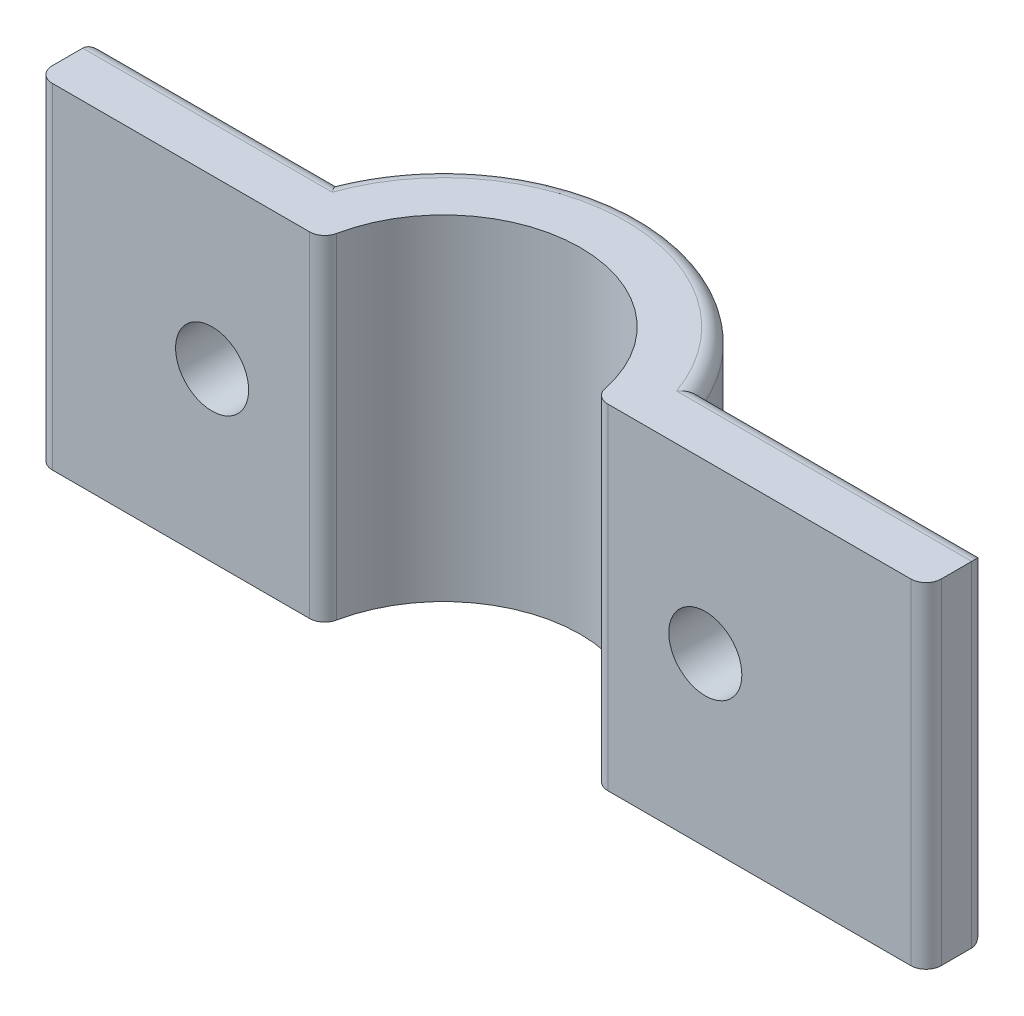
ISO-10303-21;
HEADER;
FILE_DESCRIPTION(('STEP AP214'),'2;1');
FILE_NAME('part.step','',(''),(''),'','','');
FILE_SCHEMA(('AUTOMOTIVE_DESIGN { 1 0 10303 214 1 1 1 1 }'));
ENDSEC;
DATA;
#1=APPLICATION_CONTEXT('core data for automotive mechanical design processes');
#2=APPLICATION_PROTOCOL_DEFINITION('international standard','automotive_design',2000,#1);
#3=PRODUCT_CONTEXT('',#1,'mechanical');
#4=PRODUCT('Part','Part','',(#3));
#5=PRODUCT_RELATED_PRODUCT_CATEGORY('part','',(#4));
#6=PRODUCT_DEFINITION_FORMATION('','',#4);
#7=PRODUCT_DEFINITION_CONTEXT('part definition',#1,'design');
#8=PRODUCT_DEFINITION('design','',#6,#7);
#9=PRODUCT_DEFINITION_SHAPE('','',#8);
#10=(LENGTH_UNIT() NAMED_UNIT(*) SI_UNIT(.MILLI.,.METRE.));
#11=(NAMED_UNIT(*) PLANE_ANGLE_UNIT() SI_UNIT($,.RADIAN.));
#12=(NAMED_UNIT(*) SI_UNIT($,.STERADIAN.) SOLID_ANGLE_UNIT());
#13=UNCERTAINTY_MEASURE_WITH_UNIT(LENGTH_MEASURE(1.E-05),#10,'distance_accuracy_value','');
#14=(GEOMETRIC_REPRESENTATION_CONTEXT(3) GLOBAL_UNCERTAINTY_ASSIGNED_CONTEXT((#13)) GLOBAL_UNIT_ASSIGNED_CONTEXT((#10,
#11,#12)) REPRESENTATION_CONTEXT('',''));
#15=CARTESIAN_POINT('',(0.,0.,0.));
#16=DIRECTION('',(0.,0.,1.));
#17=DIRECTION('',(1.,0.,0.));
#18=AXIS2_PLACEMENT_3D('',#15,#16,#17);
#19=CARTESIAN_POINT('',(0.,11.,-2.5));
#20=DIRECTION('',(0.,0.,-1.));
#21=DIRECTION('',(-1.,0.,0.));
#22=AXIS2_PLACEMENT_3D('',#19,#20,#21);
#23=PLANE('',#22);
#24=DIRECTION('',(0.,-1.,0.));
#25=VECTOR('',#24,1.);
#26=CARTESIAN_POINT('',(6.,11.,-2.5));
#27=LINE('',#26,#25);
#28=CARTESIAN_POINT('',(6.,10.5,-2.5));
#29=VERTEX_POINT('',#28);
#30=CARTESIAN_POINT('',(6.,0.5,-2.5));
#31=VERTEX_POINT('',#30);
#32=EDGE_CURVE('E160',#29,#31,#27,.T.);
#33=ORIENTED_EDGE('',*,*,#32,.F.);
#34=DIRECTION('',(1.,0.,0.));
#35=VECTOR('',#34,1.);
#36=CARTESIAN_POINT('',(0.,10.5,-2.5));
#37=LINE('',#36,#35);
#38=CARTESIAN_POINT('',(14.85,10.5,-2.5));
#39=VERTEX_POINT('',#38);
#40=EDGE_CURVE('E175',#29,#39,#37,.T.);
#41=ORIENTED_EDGE('',*,*,#40,.T.);
#42=DIRECTION('',(0.,-1.,0.));
#43=VECTOR('',#42,1.);
#44=CARTESIAN_POINT('',(14.85,0.,-2.5));
#45=LINE('',#44,#43);
#46=CARTESIAN_POINT('',(14.85,0.5,-2.5));
#47=VERTEX_POINT('',#46);
#48=EDGE_CURVE('E178',#39,#47,#45,.T.);
#49=ORIENTED_EDGE('',*,*,#48,.T.);
#50=DIRECTION('',(1.,0.,0.));
#51=VECTOR('',#50,1.);
#52=CARTESIAN_POINT('',(6.,0.5,-2.5));
#53=LINE('',#52,#51);
#54=EDGE_CURVE('E177',#47,#31,#53,.F.);
#55=ORIENTED_EDGE('',*,*,#54,.T.);
#56=EDGE_LOOP('',(#33,#41,#49,#55));
#57=FACE_BOUND('',#56,.T.);
#58=CARTESIAN_POINT('',(8.1,5.5,-2.5));
#59=DIRECTION('',(0.,0.,-1.));
#60=DIRECTION('',(-1.,0.,0.));
#61=AXIS2_PLACEMENT_3D('',#58,#59,#60);
#62=CIRCLE('',#61,1.2);
#63=CARTESIAN_POINT('',(6.9,5.5,-2.5));
#64=VERTEX_POINT('',#63);
#65=EDGE_CURVE('E426',#64,#64,#62,.T.);
#66=ORIENTED_EDGE('',*,*,#65,.F.);
#67=EDGE_LOOP('',(#66));
#68=FACE_BOUND('',#67,.T.);
#69=ADVANCED_FACE('F41',(#57,#68),#23,.T.);
#70=CARTESIAN_POINT('',(0.,11.,0.));
#71=DIRECTION('',(0.,-1.,0.));
#72=DIRECTION('',(0.,0.,-1.));
#73=AXIS2_PLACEMENT_3D('',#70,#71,#72);
#74=CYLINDRICAL_SURFACE('',#73,6.5);
#75=DIRECTION('',(0.,-1.,0.));
#76=VECTOR('',#75,1.);
#77=CARTESIAN_POINT('',(-6.,11.,-2.5));
#78=LINE('',#77,#76);
#79=CARTESIAN_POINT('',(-6.,10.5,-2.5));
#80=VERTEX_POINT('',#79);
#81=CARTESIAN_POINT('',(-6.,0.5,-2.5));
#82=VERTEX_POINT('',#81);
#83=EDGE_CURVE('E163',#80,#82,#78,.T.);
#84=ORIENTED_EDGE('',*,*,#83,.F.);
#85=CARTESIAN_POINT('',(0.,10.5,0.));
#86=DIRECTION('',(0.,1.,0.));
#87=DIRECTION('',(0.,0.,1.));
#88=AXIS2_PLACEMENT_3D('',#85,#86,#87);
#89=CIRCLE('',#88,6.5);
#90=EDGE_CURVE('E157',#80,#29,#89,.F.);
#91=ORIENTED_EDGE('',*,*,#90,.T.);
#92=ORIENTED_EDGE('',*,*,#32,.T.);
#93=CARTESIAN_POINT('',(0.,0.5,0.));
#94=DIRECTION('',(0.,1.,0.));
#95=DIRECTION('',(0.,0.,1.));
#96=AXIS2_PLACEMENT_3D('',#93,#94,#95);
#97=CIRCLE('',#96,6.5);
#98=EDGE_CURVE('E169',#31,#82,#97,.T.);
#99=ORIENTED_EDGE('',*,*,#98,.T.);
#100=EDGE_LOOP('',(#84,#91,#92,#99));
#101=FACE_BOUND('',#100,.T.);
#102=ADVANCED_FACE('F159',(#101),#74,.T.);
#103=CARTESIAN_POINT('',(0.,11.,-2.5));
#104=DIRECTION('',(0.,0.,-1.));
#105=DIRECTION('',(-1.,0.,0.));
#106=AXIS2_PLACEMENT_3D('',#103,#104,#105);
#107=PLANE('',#106);
#108=CARTESIAN_POINT('',(-8.1,5.5,-2.5));
#109=DIRECTION('',(0.,0.,-1.));
#110=DIRECTION('',(-1.,0.,0.));
#111=AXIS2_PLACEMENT_3D('',#108,#109,#110);
#112=CIRCLE('',#111,1.2);
#113=CARTESIAN_POINT('',(-9.3,5.5,-2.5));
#114=VERTEX_POINT('',#113);
#115=EDGE_CURVE('E430',#114,#114,#112,.T.);
#116=ORIENTED_EDGE('',*,*,#115,.F.);
#117=EDGE_LOOP('',(#116));
#118=FACE_BOUND('',#117,.T.);
#119=DIRECTION('',(0.,-1.,0.));
#120=VECTOR('',#119,1.);
#121=CARTESIAN_POINT('',(-13.35,11.,-2.5));
#122=LINE('',#121,#120);
#123=CARTESIAN_POINT('',(-13.35,0.5,-2.5));
#124=VERTEX_POINT('',#123);
#125=CARTESIAN_POINT('',(-13.35,10.5,-2.5));
#126=VERTEX_POINT('',#125);
#127=EDGE_CURVE('E210',#124,#126,#122,.F.);
#128=ORIENTED_EDGE('',*,*,#127,.T.);
#129=DIRECTION('',(1.,0.,0.));
#130=VECTOR('',#129,1.);
#131=CARTESIAN_POINT('',(0.,10.5,-2.5));
#132=LINE('',#131,#130);
#133=EDGE_CURVE('E214',#126,#80,#132,.T.);
#134=ORIENTED_EDGE('',*,*,#133,.T.);
#135=ORIENTED_EDGE('',*,*,#83,.T.);
#136=DIRECTION('',(1.,0.,0.));
#137=VECTOR('',#136,1.);
#138=CARTESIAN_POINT('',(-13.85,0.5,-2.5));
#139=LINE('',#138,#137);
#140=EDGE_CURVE('E212',#82,#124,#139,.F.);
#141=ORIENTED_EDGE('',*,*,#140,.T.);
#142=EDGE_LOOP('',(#128,#134,#135,#141));
#143=FACE_BOUND('',#142,.T.);
#144=ADVANCED_FACE('F392',(#118,#143),#107,.T.);
#145=CARTESIAN_POINT('',(-13.85,11.,0.));
#146=DIRECTION('',(1.,0.,0.));
#147=DIRECTION('',(0.,0.,-1.));
#148=AXIS2_PLACEMENT_3D('',#145,#146,#147);
#149=PLANE('',#148);
#150=DIRECTION('',(0.,0.,1.));
#151=VECTOR('',#150,1.);
#152=CARTESIAN_POINT('',(-13.85,0.,0.));
#153=LINE('',#152,#151);
#154=CARTESIAN_POINT('',(-13.85,0.,-2.));
#155=VERTEX_POINT('',#154);
#156=CARTESIAN_POINT('',(-13.85,0.,-1.));
#157=VERTEX_POINT('',#156);
#158=EDGE_CURVE('E318',#155,#157,#153,.T.);
#159=ORIENTED_EDGE('',*,*,#158,.T.);
#160=DIRECTION('',(0.,-1.,0.));
#161=VECTOR('',#160,1.);
#162=CARTESIAN_POINT('',(-13.85,11.,-1.));
#163=LINE('',#162,#161);
#164=CARTESIAN_POINT('',(-13.85,11.,-1.));
#165=VERTEX_POINT('',#164);
#166=EDGE_CURVE('E235',#157,#165,#163,.F.);
#167=ORIENTED_EDGE('',*,*,#166,.T.);
#168=DIRECTION('',(0.,0.,1.));
#169=VECTOR('',#168,1.);
#170=CARTESIAN_POINT('',(-13.85,11.,0.));
#171=LINE('',#170,#169);
#172=CARTESIAN_POINT('',(-13.85,11.,-2.));
#173=VERTEX_POINT('',#172);
#174=EDGE_CURVE('E321',#173,#165,#171,.T.);
#175=ORIENTED_EDGE('',*,*,#174,.F.);
#176=DIRECTION('',(0.,-1.,0.));
#177=VECTOR('',#176,1.);
#178=CARTESIAN_POINT('',(-13.85,0.,-2.));
#179=LINE('',#178,#177);
#180=EDGE_CURVE('E233',#173,#155,#179,.T.);
#181=ORIENTED_EDGE('',*,*,#180,.T.);
#182=EDGE_LOOP('',(#159,#167,#175,#181));
#183=FACE_BOUND('',#182,.T.);
#184=ADVANCED_FACE('F317',(#183),#149,.F.);
#185=CARTESIAN_POINT('',(0.,11.,-0.500000000000001));
#186=DIRECTION('',(0.,0.,1.));
#187=DIRECTION('',(1.,0.,0.));
#188=AXIS2_PLACEMENT_3D('',#185,#186,#187);
#189=PLANE('',#188);
#190=CARTESIAN_POINT('',(-8.1,5.5,-0.5));
#191=DIRECTION('',(0.,0.,1.));
#192=DIRECTION('',(1.,0.,0.));
#193=AXIS2_PLACEMENT_3D('',#190,#191,#192);
#194=CIRCLE('',#193,1.2);
#195=CARTESIAN_POINT('',(-6.9,5.5,-0.500000000000001));
#196=VERTEX_POINT('',#195);
#197=EDGE_CURVE('E305',#196,#196,#194,.F.);
#198=ORIENTED_EDGE('',*,*,#197,.T.);
#199=EDGE_LOOP('',(#198));
#200=FACE_BOUND('',#199,.T.);
#201=DIRECTION('',(-1.,0.,0.));
#202=VECTOR('',#201,1.);
#203=CARTESIAN_POINT('',(0.,11.,-0.500000000000001));
#204=LINE('',#203,#202);
#205=CARTESIAN_POINT('',(-4.89897948556635,11.,-0.500000000000001));
#206=VERTEX_POINT('',#205);
#207=CARTESIAN_POINT('',(-13.35,11.,-0.5));
#208=VERTEX_POINT('',#207);
#209=EDGE_CURVE('E344',#206,#208,#204,.T.);
#210=ORIENTED_EDGE('',*,*,#209,.T.);
#211=DIRECTION('',(0.,-1.,0.));
#212=VECTOR('',#211,1.);
#213=CARTESIAN_POINT('',(-13.35,0.,-0.5));
#214=LINE('',#213,#212);
#215=CARTESIAN_POINT('',(-13.35,0.,-0.5));
#216=VERTEX_POINT('',#215);
#217=EDGE_CURVE('E230',#208,#216,#214,.T.);
#218=ORIENTED_EDGE('',*,*,#217,.T.);
#219=DIRECTION('',(-1.,0.,0.));
#220=VECTOR('',#219,1.);
#221=CARTESIAN_POINT('',(0.,0.,-0.500000000000001));
#222=LINE('',#221,#220);
#223=CARTESIAN_POINT('',(-4.89897948556635,0.,-0.500000000000001));
#224=VERTEX_POINT('',#223);
#225=EDGE_CURVE('E324',#224,#216,#222,.T.);
#226=ORIENTED_EDGE('',*,*,#225,.F.);
#227=DIRECTION('',(0.,-1.,0.));
#228=VECTOR('',#227,1.);
#229=CARTESIAN_POINT('',(-4.89897948556635,11.,-0.500000000000001));
#230=LINE('',#229,#228);
#231=EDGE_CURVE('E168',#224,#206,#230,.F.);
#232=ORIENTED_EDGE('',*,*,#231,.T.);
#233=EDGE_LOOP('',(#210,#218,#226,#232));
#234=FACE_BOUND('',#233,.T.);
#235=ADVANCED_FACE('F400',(#200,#234),#189,.T.);
#236=CARTESIAN_POINT('',(0.,11.,0.));
#237=DIRECTION('',(0.,-1.,0.));
#238=DIRECTION('',(0.,0.,-1.));
#239=AXIS2_PLACEMENT_3D('',#236,#237,#238);
#240=CYLINDRICAL_SURFACE('',#239,4.5);
#241=CARTESIAN_POINT('',(0.,11.,0.));
#242=DIRECTION('',(0.,1.,0.));
#243=DIRECTION('',(0.,0.,1.));
#244=AXIS2_PLACEMENT_3D('',#241,#242,#243);
#245=CIRCLE('',#244,4.5);
#246=CARTESIAN_POINT('',(4.40908153700972,11.,-0.900000000000001));
#247=VERTEX_POINT('',#246);
#248=CARTESIAN_POINT('',(-4.40908153700972,11.,-0.900000000000001));
#249=VERTEX_POINT('',#248);
#250=EDGE_CURVE('E357',#247,#249,#245,.T.);
#251=ORIENTED_EDGE('',*,*,#250,.T.);
#252=DIRECTION('',(0.,-1.,0.));
#253=VECTOR('',#252,1.);
#254=CARTESIAN_POINT('',(-4.40908153700972,11.,-0.900000000000001));
#255=LINE('',#254,#253);
#256=CARTESIAN_POINT('',(-4.40908153700972,0.,-0.900000000000001));
#257=VERTEX_POINT('',#256);
#258=EDGE_CURVE('E239',#249,#257,#255,.T.);
#259=ORIENTED_EDGE('',*,*,#258,.T.);
#260=CARTESIAN_POINT('',(0.,0.,0.));
#261=DIRECTION('',(0.,1.,0.));
#262=DIRECTION('',(0.,0.,1.));
#263=AXIS2_PLACEMENT_3D('',#260,#261,#262);
#264=CIRCLE('',#263,4.5);
#265=CARTESIAN_POINT('',(4.40908153700972,0.,-0.900000000000001));
#266=VERTEX_POINT('',#265);
#267=EDGE_CURVE('E347',#266,#257,#264,.T.);
#268=ORIENTED_EDGE('',*,*,#267,.F.);
#269=DIRECTION('',(0.,-1.,0.));
#270=VECTOR('',#269,1.);
#271=CARTESIAN_POINT('',(4.40908153700972,11.,-0.900000000000001));
#272=LINE('',#271,#270);
#273=EDGE_CURVE('E237',#266,#247,#272,.F.);
#274=ORIENTED_EDGE('',*,*,#273,.T.);
#275=EDGE_LOOP('',(#251,#259,#268,#274));
#276=FACE_BOUND('',#275,.T.);
#277=ADVANCED_FACE('F368',(#276),#240,.F.);
#278=CARTESIAN_POINT('',(0.,11.,-0.500000000000001));
#279=DIRECTION('',(0.,0.,-1.));
#280=DIRECTION('',(-1.,0.,0.));
#281=AXIS2_PLACEMENT_3D('',#278,#279,#280);
#282=PLANE('',#281);
#283=CARTESIAN_POINT('',(8.1,5.5,-0.500000000000001));
#284=DIRECTION('',(0.,0.,1.));
#285=DIRECTION('',(1.,0.,0.));
#286=AXIS2_PLACEMENT_3D('',#283,#284,#285);
#287=CIRCLE('',#286,1.2);
#288=CARTESIAN_POINT('',(9.3,5.5,-0.500000000000001));
#289=VERTEX_POINT('',#288);
#290=EDGE_CURVE('E325',#289,#289,#287,.F.);
#291=ORIENTED_EDGE('',*,*,#290,.T.);
#292=EDGE_LOOP('',(#291));
#293=FACE_BOUND('',#292,.T.);
#294=DIRECTION('',(1.,0.,0.));
#295=VECTOR('',#294,1.);
#296=CARTESIAN_POINT('',(0.,11.,-0.500000000000001));
#297=LINE('',#296,#295);
#298=CARTESIAN_POINT('',(4.89897948556635,11.,-0.500000000000001));
#299=VERTEX_POINT('',#298);
#300=CARTESIAN_POINT('',(14.85,11.,-0.500000000000001));
#301=VERTEX_POINT('',#300);
#302=EDGE_CURVE('E353',#299,#301,#297,.T.);
#303=ORIENTED_EDGE('',*,*,#302,.F.);
#304=DIRECTION('',(0.,1.,0.));
#305=VECTOR('',#304,1.);
#306=CARTESIAN_POINT('',(4.89897948556635,0.,-0.500000000000001));
#307=LINE('',#306,#305);
#308=CARTESIAN_POINT('',(4.89897948556635,0.,-0.500000000000001));
#309=VERTEX_POINT('',#308);
#310=EDGE_CURVE('E244',#299,#309,#307,.F.);
#311=ORIENTED_EDGE('',*,*,#310,.T.);
#312=DIRECTION('',(1.,0.,0.));
#313=VECTOR('',#312,1.);
#314=CARTESIAN_POINT('',(0.,0.,-0.500000000000001));
#315=LINE('',#314,#313);
#316=CARTESIAN_POINT('',(14.85,0.,-0.500000000000001));
#317=VERTEX_POINT('',#316);
#318=EDGE_CURVE('E342',#309,#317,#315,.T.);
#319=ORIENTED_EDGE('',*,*,#318,.T.);
#320=DIRECTION('',(0.,-1.,0.));
#321=VECTOR('',#320,1.);
#322=CARTESIAN_POINT('',(14.85,11.,-0.500000000000001));
#323=LINE('',#322,#321);
#324=EDGE_CURVE('E242',#317,#301,#323,.F.);
#325=ORIENTED_EDGE('',*,*,#324,.T.);
#326=EDGE_LOOP('',(#303,#311,#319,#325));
#327=FACE_BOUND('',#326,.T.);
#328=ADVANCED_FACE('F379',(#293,#327),#282,.F.);
#329=CARTESIAN_POINT('',(15.35,11.,0.));
#330=DIRECTION('',(-1.,0.,0.));
#331=DIRECTION('',(0.,0.,1.));
#332=AXIS2_PLACEMENT_3D('',#329,#330,#331);
#333=PLANE('',#332);
#334=DIRECTION('',(0.,0.,-1.));
#335=VECTOR('',#334,1.);
#336=CARTESIAN_POINT('',(15.35,11.,0.));
#337=LINE('',#336,#335);
#338=CARTESIAN_POINT('',(15.35,11.,-1.));
#339=VERTEX_POINT('',#338);
#340=CARTESIAN_POINT('',(15.35,11.,-2.));
#341=VERTEX_POINT('',#340);
#342=EDGE_CURVE('E351',#339,#341,#337,.T.);
#343=ORIENTED_EDGE('',*,*,#342,.F.);
#344=DIRECTION('',(0.,-1.,0.));
#345=VECTOR('',#344,1.);
#346=CARTESIAN_POINT('',(15.35,11.,-1.));
#347=LINE('',#346,#345);
#348=CARTESIAN_POINT('',(15.35,0.,-1.));
#349=VERTEX_POINT('',#348);
#350=EDGE_CURVE('E11',#339,#349,#347,.T.);
#351=ORIENTED_EDGE('',*,*,#350,.T.);
#352=DIRECTION('',(0.,0.,-1.));
#353=VECTOR('',#352,1.);
#354=CARTESIAN_POINT('',(15.35,0.,0.));
#355=LINE('',#354,#353);
#356=CARTESIAN_POINT('',(15.35,0.,-2.));
#357=VERTEX_POINT('',#356);
#358=EDGE_CURVE('E336',#349,#357,#355,.T.);
#359=ORIENTED_EDGE('',*,*,#358,.T.);
#360=DIRECTION('',(0.,-1.,0.));
#361=VECTOR('',#360,1.);
#362=CARTESIAN_POINT('',(15.35,11.,-2.));
#363=LINE('',#362,#361);
#364=EDGE_CURVE('E50',#357,#341,#363,.F.);
#365=ORIENTED_EDGE('',*,*,#364,.T.);
#366=EDGE_LOOP('',(#343,#351,#359,#365));
#367=FACE_BOUND('',#366,.T.);
#368=ADVANCED_FACE('F339',(#367),#333,.F.);
#369=CARTESIAN_POINT('',(0.,11.,0.));
#370=DIRECTION('',(0.,1.,0.));
#371=DIRECTION('',(0.,0.,1.));
#372=AXIS2_PLACEMENT_3D('',#369,#370,#371);
#373=PLANE('',#372);
#374=ORIENTED_EDGE('',*,*,#342,.T.);
#375=DIRECTION('',(1.,0.,0.));
#376=VECTOR('',#375,1.);
#377=CARTESIAN_POINT('',(0.,11.,-2.));
#378=LINE('',#377,#376);
#379=CARTESIAN_POINT('',(5.65685424949238,11.,-2.));
#380=VERTEX_POINT('',#379);
#381=EDGE_CURVE('E208',#341,#380,#378,.F.);
#382=ORIENTED_EDGE('',*,*,#381,.T.);
#383=CARTESIAN_POINT('',(0.,11.,0.));
#384=DIRECTION('',(0.,1.,0.));
#385=DIRECTION('',(0.,0.,1.));
#386=AXIS2_PLACEMENT_3D('',#383,#384,#385);
#387=CIRCLE('',#386,6.);
#388=CARTESIAN_POINT('',(-5.65685424949238,11.,-2.));
#389=VERTEX_POINT('',#388);
#390=EDGE_CURVE('E183',#380,#389,#387,.T.);
#391=ORIENTED_EDGE('',*,*,#390,.T.);
#392=DIRECTION('',(1.,0.,0.));
#393=VECTOR('',#392,1.);
#394=CARTESIAN_POINT('',(0.,11.,-2.));
#395=LINE('',#394,#393);
#396=EDGE_CURVE('E206',#389,#173,#395,.F.);
#397=ORIENTED_EDGE('',*,*,#396,.T.);
#398=ORIENTED_EDGE('',*,*,#174,.T.);
#399=CARTESIAN_POINT('',(-13.35,11.,-1.));
#400=DIRECTION('',(0.,1.,0.));
#401=DIRECTION('',(0.,0.,1.));
#402=AXIS2_PLACEMENT_3D('',#399,#400,#401);
#403=CIRCLE('',#402,0.5);
#404=EDGE_CURVE('E203',#165,#208,#403,.T.);
#405=ORIENTED_EDGE('',*,*,#404,.T.);
#406=ORIENTED_EDGE('',*,*,#209,.F.);
#407=CARTESIAN_POINT('',(-4.89897948556635,11.,-1.));
#408=DIRECTION('',(0.,1.,0.));
#409=DIRECTION('',(0.,0.,1.));
#410=AXIS2_PLACEMENT_3D('',#407,#408,#409);
#411=CIRCLE('',#410,0.5);
#412=EDGE_CURVE('E201',#206,#249,#411,.T.);
#413=ORIENTED_EDGE('',*,*,#412,.T.);
#414=ORIENTED_EDGE('',*,*,#250,.F.);
#415=CARTESIAN_POINT('',(4.89897948556635,11.,-1.));
#416=DIRECTION('',(0.,1.,0.));
#417=DIRECTION('',(0.,0.,1.));
#418=AXIS2_PLACEMENT_3D('',#415,#416,#417);
#419=CIRCLE('',#418,0.5);
#420=EDGE_CURVE('E195',#247,#299,#419,.T.);
#421=ORIENTED_EDGE('',*,*,#420,.T.);
#422=ORIENTED_EDGE('',*,*,#302,.T.);
#423=CARTESIAN_POINT('',(14.85,11.,-1.));
#424=DIRECTION('',(0.,1.,0.));
#425=DIRECTION('',(0.,0.,1.));
#426=AXIS2_PLACEMENT_3D('',#423,#424,#425);
#427=CIRCLE('',#426,0.5);
#428=EDGE_CURVE('E193',#301,#339,#427,.T.);
#429=ORIENTED_EDGE('',*,*,#428,.T.);
#430=EDGE_LOOP('',(#374,#382,#391,#397,#398,#405,#406,#413,#414,#421,#422,#429));
#431=FACE_BOUND('',#430,.T.);
#432=ADVANCED_FACE('F376',(#431),#373,.T.);
#433=CARTESIAN_POINT('',(0.,0.,0.));
#434=DIRECTION('',(0.,1.,0.));
#435=DIRECTION('',(0.,0.,1.));
#436=AXIS2_PLACEMENT_3D('',#433,#434,#435);
#437=PLANE('',#436);
#438=ORIENTED_EDGE('',*,*,#158,.F.);
#439=DIRECTION('',(1.,0.,0.));
#440=VECTOR('',#439,1.);
#441=CARTESIAN_POINT('',(-6.,0.,-2.));
#442=LINE('',#441,#440);
#443=CARTESIAN_POINT('',(-5.65685424949238,0.,-2.));
#444=VERTEX_POINT('',#443);
#445=EDGE_CURVE('E63',#155,#444,#442,.T.);
#446=ORIENTED_EDGE('',*,*,#445,.T.);
#447=CARTESIAN_POINT('',(0.,0.,0.));
#448=DIRECTION('',(0.,1.,0.));
#449=DIRECTION('',(0.,0.,1.));
#450=AXIS2_PLACEMENT_3D('',#447,#448,#449);
#451=CIRCLE('',#450,6.);
#452=CARTESIAN_POINT('',(5.65685424949238,0.,-2.));
#453=VERTEX_POINT('',#452);
#454=EDGE_CURVE('E58',#444,#453,#451,.F.);
#455=ORIENTED_EDGE('',*,*,#454,.T.);
#456=DIRECTION('',(1.,0.,0.));
#457=VECTOR('',#456,1.);
#458=CARTESIAN_POINT('',(15.35,0.,-2.));
#459=LINE('',#458,#457);
#460=EDGE_CURVE('E225',#453,#357,#459,.T.);
#461=ORIENTED_EDGE('',*,*,#460,.T.);
#462=ORIENTED_EDGE('',*,*,#358,.F.);
#463=CARTESIAN_POINT('',(14.85,0.,-1.));
#464=DIRECTION('',(0.,1.,0.));
#465=DIRECTION('',(0.,0.,1.));
#466=AXIS2_PLACEMENT_3D('',#463,#464,#465);
#467=CIRCLE('',#466,0.5);
#468=EDGE_CURVE('E216',#349,#317,#467,.F.);
#469=ORIENTED_EDGE('',*,*,#468,.T.);
#470=ORIENTED_EDGE('',*,*,#318,.F.);
#471=CARTESIAN_POINT('',(4.89897948556635,0.,-1.));
#472=DIRECTION('',(0.,1.,0.));
#473=DIRECTION('',(0.,0.,1.));
#474=AXIS2_PLACEMENT_3D('',#471,#472,#473);
#475=CIRCLE('',#474,0.5);
#476=EDGE_CURVE('E218',#309,#266,#475,.F.);
#477=ORIENTED_EDGE('',*,*,#476,.T.);
#478=ORIENTED_EDGE('',*,*,#267,.T.);
#479=CARTESIAN_POINT('',(-4.89897948556635,0.,-1.));
#480=DIRECTION('',(0.,1.,0.));
#481=DIRECTION('',(0.,0.,1.));
#482=AXIS2_PLACEMENT_3D('',#479,#480,#481);
#483=CIRCLE('',#482,0.5);
#484=EDGE_CURVE('E220',#257,#224,#483,.F.);
#485=ORIENTED_EDGE('',*,*,#484,.T.);
#486=ORIENTED_EDGE('',*,*,#225,.T.);
#487=CARTESIAN_POINT('',(-13.35,0.,-1.));
#488=DIRECTION('',(0.,1.,0.));
#489=DIRECTION('',(0.,0.,1.));
#490=AXIS2_PLACEMENT_3D('',#487,#488,#489);
#491=CIRCLE('',#490,0.5);
#492=EDGE_CURVE('E222',#216,#157,#491,.F.);
#493=ORIENTED_EDGE('',*,*,#492,.T.);
#494=EDGE_LOOP('',(#438,#446,#455,#461,#462,#469,#470,#477,#478,#485,#486,#493));
#495=FACE_BOUND('',#494,.T.);
#496=ADVANCED_FACE('F322',(#495),#437,.F.);
#497=CARTESIAN_POINT('',(8.1,5.5,2.89411254969543));
#498=DIRECTION('',(0.,0.,-1.));
#499=DIRECTION('',(-1.,0.,0.));
#500=AXIS2_PLACEMENT_3D('',#497,#498,#499);
#501=CYLINDRICAL_SURFACE('',#500,1.2);
#502=ORIENTED_EDGE('',*,*,#65,.T.);
#503=EDGE_LOOP('',(#502));
#504=FACE_BOUND('',#503,.T.);
#505=ORIENTED_EDGE('',*,*,#290,.F.);
#506=EDGE_LOOP('',(#505));
#507=FACE_BOUND('',#506,.T.);
#508=ADVANCED_FACE('F413',(#504,#507),#501,.F.);
#509=CARTESIAN_POINT('',(-8.1,5.5,2.89411254969543));
#510=DIRECTION('',(0.,0.,-1.));
#511=DIRECTION('',(-1.,0.,0.));
#512=AXIS2_PLACEMENT_3D('',#509,#510,#511);
#513=CYLINDRICAL_SURFACE('',#512,1.2);
#514=ORIENTED_EDGE('',*,*,#115,.T.);
#515=EDGE_LOOP('',(#514));
#516=FACE_BOUND('',#515,.T.);
#517=ORIENTED_EDGE('',*,*,#197,.F.);
#518=EDGE_LOOP('',(#517));
#519=FACE_BOUND('',#518,.T.);
#520=ADVANCED_FACE('F416',(#516,#519),#513,.F.);
#521=CARTESIAN_POINT('',(0.,0.5,-2.));
#522=DIRECTION('',(-1.,0.,0.));
#523=DIRECTION('',(0.,0.,1.));
#524=AXIS2_PLACEMENT_3D('',#521,#522,#523);
#525=CYLINDRICAL_SURFACE('',#524,0.5);
#526=CARTESIAN_POINT('',(-6.,0.5,-2.5));
#527=CARTESIAN_POINT('',(-6.00002173580338,0.475257279397214,-2.50003467890509));
#528=CARTESIAN_POINT('',(-5.99877726352506,0.450547733458578,-2.49816588246662));
#529=CARTESIAN_POINT('',(-5.99393457540392,0.402012394616218,-2.49090519553763));
#530=CARTESIAN_POINT('',(-5.99034829975771,0.378182763006307,-2.48553117734283));
#531=CARTESIAN_POINT('',(-5.98100287487304,0.331986971649653,-2.47154688158862));
#532=CARTESIAN_POINT('',(-5.97524623656618,0.309619155656273,-2.46294034383271));
#533=CARTESIAN_POINT('',(-5.96182336087112,0.266786324555336,-2.44291156647527));
#534=CARTESIAN_POINT('',(-5.95415513369966,0.246323322854282,-2.43148639306977));
#535=CARTESIAN_POINT('',(-5.93669076611329,0.206492655455345,-2.40552710660915));
#536=CARTESIAN_POINT('',(-5.92679457929041,0.187264309795342,-2.3908476205638));
#537=CARTESIAN_POINT('',(-5.90552274928344,0.1515625336377,-2.35938571465932));
#538=CARTESIAN_POINT('',(-5.89414682002641,0.135089637251886,-2.34260288819238));
#539=CARTESIAN_POINT('',(-5.86831511672241,0.102597588054589,-2.30461632093368));
#540=CARTESIAN_POINT('',(-5.8536571274823,0.0870658123548616,-2.28313374581184));
#541=CARTESIAN_POINT('',(-5.8231553035544,0.0598337854972895,-2.2386130384289));
#542=CARTESIAN_POINT('',(-5.80730985910575,0.048138855511002,-2.21557279883125));
#543=CARTESIAN_POINT('',(-5.770074079071,0.0257150296092313,-2.16166452648314));
#544=CARTESIAN_POINT('',(-5.74840689584967,0.0162467817613824,-2.13046194464784));
#545=CARTESIAN_POINT('',(-5.70435108547189,0.00352173198913566,-2.06739214152272));
#546=CARTESIAN_POINT('',(-5.68196390942424,0.000253146005272786,-2.03552629778111));
#547=CARTESIAN_POINT('',(-5.65862682993489,4.71102715579498E-06,-2.00250709914428));
#548=CARTESIAN_POINT('',(-5.65774057964348,-2.6282801631192E-09,-2.0012534571436));
#549=CARTESIAN_POINT('',(-5.65685424949238,0.,-2.));
#550=B_SPLINE_CURVE_WITH_KNOTS('',3,(#526,#527,#528,#529,#530,#531,#532,#533,#534,#535,#536,
#537,#538,#539,#540,#541,#542,#543,#544,#545,#546,#547,#548,#549),.UNSPECIFIED.,.F.,.F.,(4,2,2,
2,2,2,2,2,2,2,2,4),(0.,0.0740742332709424,0.14777370128243,0.221388165400129,0.295079577527592,
0.373191085272369,0.451317716523507,0.541849734875035,0.632506782957617,0.749418725244223,
0.8661082226069,0.870714023705967),.UNSPECIFIED.);
#551=EDGE_CURVE('E298',#444,#82,#550,.F.);
#552=ORIENTED_EDGE('',*,*,#551,.F.);
#553=ORIENTED_EDGE('',*,*,#445,.F.);
#554=CARTESIAN_POINT('',(-13.35,0.5,-2.));
#555=DIRECTION('',(-0.707106781186547,0.707106781186547,0.));
#556=DIRECTION('',(0.707106781186547,0.707106781186547,0.));
#557=AXIS2_PLACEMENT_3D('',#554,#555,#556);
#558=ELLIPSE('',#557,0.707106781186547,0.5);
#559=EDGE_CURVE('E45',#124,#155,#558,.T.);
#560=ORIENTED_EDGE('',*,*,#559,.F.);
#561=ORIENTED_EDGE('',*,*,#140,.F.);
#562=EDGE_LOOP('',(#552,#553,#560,#561));
#563=FACE_BOUND('',#562,.T.);
#564=ADVANCED_FACE('F294',(#563),#525,.T.);
#565=CARTESIAN_POINT('',(-13.35,11.,-2.));
#566=DIRECTION('',(0.,1.,0.));
#567=DIRECTION('',(0.,0.,1.));
#568=AXIS2_PLACEMENT_3D('',#565,#566,#567);
#569=CYLINDRICAL_SURFACE('',#568,0.5);
#570=ORIENTED_EDGE('',*,*,#559,.T.);
#571=ORIENTED_EDGE('',*,*,#180,.F.);
#572=CARTESIAN_POINT('',(-13.35,10.5,-2.));
#573=DIRECTION('',(0.707106781186547,0.707106781186547,0.));
#574=DIRECTION('',(-0.707106781186547,0.707106781186547,0.));
#575=AXIS2_PLACEMENT_3D('',#572,#573,#574);
#576=ELLIPSE('',#575,0.707106781186547,0.5);
#577=EDGE_CURVE('E288',#126,#173,#576,.T.);
#578=ORIENTED_EDGE('',*,*,#577,.F.);
#579=ORIENTED_EDGE('',*,*,#127,.F.);
#580=EDGE_LOOP('',(#570,#571,#578,#579));
#581=FACE_BOUND('',#580,.T.);
#582=ADVANCED_FACE('F292',(#581),#569,.T.);
#583=CARTESIAN_POINT('',(0.,0.5,0.));
#584=DIRECTION('',(0.,1.,0.));
#585=DIRECTION('',(0.,0.,1.));
#586=AXIS2_PLACEMENT_3D('',#583,#584,#585);
#587=TOROIDAL_SURFACE('',#586,6.,0.5);
#588=ORIENTED_EDGE('',*,*,#551,.T.);
#589=ORIENTED_EDGE('',*,*,#98,.F.);
#590=CARTESIAN_POINT('',(6.,0.5,-2.5));
#591=CARTESIAN_POINT('',(6.00002173580338,0.475257279397214,-2.50003467890509));
#592=CARTESIAN_POINT('',(5.99877726352506,0.450547733458578,-2.49816588246662));
#593=CARTESIAN_POINT('',(5.99393457540392,0.402012394616218,-2.49090519553763));
#594=CARTESIAN_POINT('',(5.99034829975771,0.378182763006307,-2.48553117734283));
#595=CARTESIAN_POINT('',(5.98100287487304,0.331986971649653,-2.47154688158862));
#596=CARTESIAN_POINT('',(5.97524623656618,0.309619155656273,-2.46294034383271));
#597=CARTESIAN_POINT('',(5.96182336087112,0.266786324555336,-2.44291156647527));
#598=CARTESIAN_POINT('',(5.95415513369966,0.246323322854282,-2.43148639306977));
#599=CARTESIAN_POINT('',(5.93669076611329,0.206492655455345,-2.40552710660915));
#600=CARTESIAN_POINT('',(5.92679457929041,0.187264309795342,-2.3908476205638));
#601=CARTESIAN_POINT('',(5.90552274928344,0.1515625336377,-2.35938571465932));
#602=CARTESIAN_POINT('',(5.89414682002641,0.135089637251886,-2.34260288819238));
#603=CARTESIAN_POINT('',(5.86831511672241,0.102597588054589,-2.30461632093368));
#604=CARTESIAN_POINT('',(5.8536571274823,0.0870658123548616,-2.28313374581184));
#605=CARTESIAN_POINT('',(5.8231553035544,0.0598337854972895,-2.2386130384289));
#606=CARTESIAN_POINT('',(5.80730985910575,0.048138855511002,-2.21557279883125));
#607=CARTESIAN_POINT('',(5.770074079071,0.0257150296092313,-2.16166452648314));
#608=CARTESIAN_POINT('',(5.74840689584967,0.0162467817613824,-2.13046194464784));
#609=CARTESIAN_POINT('',(5.70435108547189,0.00352173198913566,-2.06739214152272));
#610=CARTESIAN_POINT('',(5.68196390942424,0.000253146005272786,-2.03552629778111));
#611=CARTESIAN_POINT('',(5.65862682993489,4.71102715579498E-06,-2.00250709914428));
#612=CARTESIAN_POINT('',(5.65774057964348,-2.6282801631192E-09,-2.0012534571436));
#613=CARTESIAN_POINT('',(5.65685424949238,0.,-2.));
#614=B_SPLINE_CURVE_WITH_KNOTS('',3,(#590,#591,#592,#593,#594,#595,#596,#597,#598,#599,#600,
#601,#602,#603,#604,#605,#606,#607,#608,#609,#610,#611,#612,#613),.UNSPECIFIED.,.F.,.F.,(4,2,2,
2,2,2,2,2,2,2,2,4),(0.,0.0740742332709424,0.14777370128243,0.221388165400129,0.295079577527592,
0.373191085272369,0.451317716523507,0.541849734875035,0.632506782957617,0.749418725244223,
0.8661082226069,0.870714023705967),.UNSPECIFIED.);
#615=EDGE_CURVE('E281',#453,#31,#614,.F.);
#616=ORIENTED_EDGE('',*,*,#615,.F.);
#617=ORIENTED_EDGE('',*,*,#454,.F.);
#618=EDGE_LOOP('',(#588,#589,#616,#617));
#619=FACE_BOUND('',#618,.T.);
#620=ADVANCED_FACE('F271',(#619),#587,.T.);
#621=CARTESIAN_POINT('',(0.,10.5,-2.));
#622=DIRECTION('',(1.,0.,0.));
#623=DIRECTION('',(0.,0.,-1.));
#624=AXIS2_PLACEMENT_3D('',#621,#622,#623);
#625=CYLINDRICAL_SURFACE('',#624,0.5);
#626=ORIENTED_EDGE('',*,*,#577,.T.);
#627=ORIENTED_EDGE('',*,*,#396,.F.);
#628=CARTESIAN_POINT('',(-6.,10.5,-2.5));
#629=CARTESIAN_POINT('',(-6.00002173580338,10.5247427206028,-2.50003467890509));
#630=CARTESIAN_POINT('',(-5.99877726352506,10.5494522665414,-2.49816588246662));
#631=CARTESIAN_POINT('',(-5.99393457540393,10.5979876053838,-2.49090519553763));
#632=CARTESIAN_POINT('',(-5.99034829975771,10.6218172369937,-2.48553117734283));
#633=CARTESIAN_POINT('',(-5.98100287487304,10.6680130283503,-2.47154688158862));
#634=CARTESIAN_POINT('',(-5.97524623656618,10.6903808443437,-2.46294034383271));
#635=CARTESIAN_POINT('',(-5.96182336087112,10.7332136754447,-2.44291156647527));
#636=CARTESIAN_POINT('',(-5.95415513369966,10.7536766771457,-2.43148639306977));
#637=CARTESIAN_POINT('',(-5.93669076611329,10.7935073445447,-2.40552710660915));
#638=CARTESIAN_POINT('',(-5.92679457929041,10.8127356902047,-2.3908476205638));
#639=CARTESIAN_POINT('',(-5.90552274928344,10.8484374663623,-2.35938571465932));
#640=CARTESIAN_POINT('',(-5.89414682002641,10.8649103627481,-2.34260288819237));
#641=CARTESIAN_POINT('',(-5.86831511672241,10.8974024119454,-2.30461632093368));
#642=CARTESIAN_POINT('',(-5.85365712748229,10.9129341876451,-2.28313374581185));
#643=CARTESIAN_POINT('',(-5.8231553035544,10.9401662145027,-2.23861303842889));
#644=CARTESIAN_POINT('',(-5.80730985910578,10.951861144489,-2.21557279883123));
#645=CARTESIAN_POINT('',(-5.77007407907097,10.9742849703908,-2.16166452648316));
#646=CARTESIAN_POINT('',(-5.74840689584954,10.9837532182386,-2.13046194464792));
#647=CARTESIAN_POINT('',(-5.70435108547202,10.9964782680109,-2.06739214152263));
#648=CARTESIAN_POINT('',(-5.68196390942471,10.9997468539947,-2.03552629778077));
#649=CARTESIAN_POINT('',(-5.65862682993493,10.9999952889728,-2.00250709914426));
#650=CARTESIAN_POINT('',(-5.6577405796435,11.0000000026283,-2.00125345714358));
#651=CARTESIAN_POINT('',(-5.65685424949238,11.,-2.));
#652=B_SPLINE_CURVE_WITH_KNOTS('',3,(#628,#629,#630,#631,#632,#633,#634,#635,#636,#637,#638,
#639,#640,#641,#642,#643,#644,#645,#646,#647,#648,#649,#650,#651),.UNSPECIFIED.,.F.,.F.,(4,2,2,
2,2,2,2,2,2,2,2,4),(0.,0.0740742332709402,0.14777370128243,0.221388165400128,0.295079577527593,
0.373191085272371,0.451317716523507,0.541849734875035,0.632506782957618,0.749418725244228,
0.866108222606901,0.870714023705967),.UNSPECIFIED.);
#653=EDGE_CURVE('E275',#80,#389,#652,.T.);
#654=ORIENTED_EDGE('',*,*,#653,.F.);
#655=ORIENTED_EDGE('',*,*,#133,.F.);
#656=EDGE_LOOP('',(#626,#627,#654,#655));
#657=FACE_BOUND('',#656,.T.);
#658=ADVANCED_FACE('F266',(#657),#625,.T.);
#659=CARTESIAN_POINT('',(0.,0.5,-2.));
#660=DIRECTION('',(-1.,0.,0.));
#661=DIRECTION('',(0.,0.,1.));
#662=AXIS2_PLACEMENT_3D('',#659,#660,#661);
#663=CYLINDRICAL_SURFACE('',#662,0.5);
#664=ORIENTED_EDGE('',*,*,#615,.T.);
#665=ORIENTED_EDGE('',*,*,#54,.F.);
#666=CARTESIAN_POINT('',(14.85,0.5,-2.));
#667=DIRECTION('',(0.707106781186547,0.707106781186547,0.));
#668=DIRECTION('',(-0.707106781186547,0.707106781186547,0.));
#669=AXIS2_PLACEMENT_3D('',#666,#667,#668);
#670=ELLIPSE('',#669,0.707106781186547,0.5);
#671=EDGE_CURVE('E187',#357,#47,#670,.T.);
#672=ORIENTED_EDGE('',*,*,#671,.F.);
#673=ORIENTED_EDGE('',*,*,#460,.F.);
#674=EDGE_LOOP('',(#664,#665,#672,#673));
#675=FACE_BOUND('',#674,.T.);
#676=ADVANCED_FACE('F270',(#675),#663,.T.);
#677=CARTESIAN_POINT('',(0.,10.5,0.));
#678=DIRECTION('',(0.,1.,0.));
#679=DIRECTION('',(0.,0.,1.));
#680=AXIS2_PLACEMENT_3D('',#677,#678,#679);
#681=TOROIDAL_SURFACE('',#680,6.,0.5);
#682=ORIENTED_EDGE('',*,*,#653,.T.);
#683=ORIENTED_EDGE('',*,*,#390,.F.);
#684=CARTESIAN_POINT('',(6.,10.5,-2.5));
#685=CARTESIAN_POINT('',(6.00002173580338,10.5247427206028,-2.50003467890509));
#686=CARTESIAN_POINT('',(5.99877726352506,10.5494522665414,-2.49816588246662));
#687=CARTESIAN_POINT('',(5.99393457540393,10.5979876053838,-2.49090519553763));
#688=CARTESIAN_POINT('',(5.99034829975771,10.6218172369937,-2.48553117734283));
#689=CARTESIAN_POINT('',(5.98100287487304,10.6680130283503,-2.47154688158862));
#690=CARTESIAN_POINT('',(5.97524623656618,10.6903808443437,-2.46294034383271));
#691=CARTESIAN_POINT('',(5.96182336087112,10.7332136754447,-2.44291156647527));
#692=CARTESIAN_POINT('',(5.95415513369966,10.7536766771457,-2.43148639306977));
#693=CARTESIAN_POINT('',(5.93669076611329,10.7935073445447,-2.40552710660915));
#694=CARTESIAN_POINT('',(5.92679457929041,10.8127356902047,-2.3908476205638));
#695=CARTESIAN_POINT('',(5.90552274928344,10.8484374663623,-2.35938571465932));
#696=CARTESIAN_POINT('',(5.89414682002641,10.8649103627481,-2.34260288819237));
#697=CARTESIAN_POINT('',(5.86831511672241,10.8974024119454,-2.30461632093368));
#698=CARTESIAN_POINT('',(5.85365712748229,10.9129341876451,-2.28313374581185));
#699=CARTESIAN_POINT('',(5.8231553035544,10.9401662145027,-2.23861303842889));
#700=CARTESIAN_POINT('',(5.80730985910578,10.951861144489,-2.21557279883123));
#701=CARTESIAN_POINT('',(5.77007407907097,10.9742849703908,-2.16166452648316));
#702=CARTESIAN_POINT('',(5.74840689584954,10.9837532182386,-2.13046194464792));
#703=CARTESIAN_POINT('',(5.70435108547202,10.9964782680109,-2.06739214152263));
#704=CARTESIAN_POINT('',(5.68196390942471,10.9997468539947,-2.03552629778077));
#705=CARTESIAN_POINT('',(5.65862682993493,10.9999952889728,-2.00250709914426));
#706=CARTESIAN_POINT('',(5.6577405796435,11.0000000026283,-2.00125345714358));
#707=CARTESIAN_POINT('',(5.65685424949238,11.,-2.));
#708=B_SPLINE_CURVE_WITH_KNOTS('',3,(#684,#685,#686,#687,#688,#689,#690,#691,#692,#693,#694,
#695,#696,#697,#698,#699,#700,#701,#702,#703,#704,#705,#706,#707),.UNSPECIFIED.,.F.,.F.,(4,2,2,
2,2,2,2,2,2,2,2,4),(0.,0.0740742332709402,0.14777370128243,0.221388165400128,0.295079577527593,
0.373191085272371,0.451317716523507,0.541849734875035,0.632506782957618,0.749418725244228,
0.866108222606901,0.870714023705967),.UNSPECIFIED.);
#709=EDGE_CURVE('E181',#29,#380,#708,.T.);
#710=ORIENTED_EDGE('',*,*,#709,.F.);
#711=ORIENTED_EDGE('',*,*,#90,.F.);
#712=EDGE_LOOP('',(#682,#683,#710,#711));
#713=FACE_BOUND('',#712,.T.);
#714=ADVANCED_FACE('F182',(#713),#681,.T.);
#715=CARTESIAN_POINT('',(14.85,11.,-2.));
#716=DIRECTION('',(0.,1.,0.));
#717=DIRECTION('',(0.,0.,1.));
#718=AXIS2_PLACEMENT_3D('',#715,#716,#717);
#719=CYLINDRICAL_SURFACE('',#718,0.5);
#720=ORIENTED_EDGE('',*,*,#671,.T.);
#721=ORIENTED_EDGE('',*,*,#48,.F.);
#722=CARTESIAN_POINT('',(14.85,10.5,-2.));
#723=DIRECTION('',(-0.707106781186547,0.707106781186547,0.));
#724=DIRECTION('',(0.707106781186547,0.707106781186547,0.));
#725=AXIS2_PLACEMENT_3D('',#722,#723,#724);
#726=ELLIPSE('',#725,0.707106781186547,0.5);
#727=EDGE_CURVE('E188',#341,#39,#726,.T.);
#728=ORIENTED_EDGE('',*,*,#727,.F.);
#729=ORIENTED_EDGE('',*,*,#364,.F.);
#730=EDGE_LOOP('',(#720,#721,#728,#729));
#731=FACE_BOUND('',#730,.T.);
#732=ADVANCED_FACE('F262',(#731),#719,.T.);
#733=CARTESIAN_POINT('',(0.,10.5,-2.));
#734=DIRECTION('',(1.,0.,0.));
#735=DIRECTION('',(0.,0.,-1.));
#736=AXIS2_PLACEMENT_3D('',#733,#734,#735);
#737=CYLINDRICAL_SURFACE('',#736,0.5);
#738=ORIENTED_EDGE('',*,*,#709,.T.);
#739=ORIENTED_EDGE('',*,*,#381,.F.);
#740=ORIENTED_EDGE('',*,*,#727,.T.);
#741=ORIENTED_EDGE('',*,*,#40,.F.);
#742=EDGE_LOOP('',(#738,#739,#740,#741));
#743=FACE_BOUND('',#742,.T.);
#744=ADVANCED_FACE('F190',(#743),#737,.T.);
#745=CARTESIAN_POINT('',(-13.35,11.,-1.));
#746=DIRECTION('',(0.,1.,0.));
#747=DIRECTION('',(0.,0.,1.));
#748=AXIS2_PLACEMENT_3D('',#745,#746,#747);
#749=CYLINDRICAL_SURFACE('',#748,0.5);
#750=ORIENTED_EDGE('',*,*,#404,.F.);
#751=ORIENTED_EDGE('',*,*,#166,.F.);
#752=ORIENTED_EDGE('',*,*,#492,.F.);
#753=ORIENTED_EDGE('',*,*,#217,.F.);
#754=EDGE_LOOP('',(#750,#751,#752,#753));
#755=FACE_BOUND('',#754,.T.);
#756=ADVANCED_FACE('F261',(#755),#749,.T.);
#757=CARTESIAN_POINT('',(-4.89897948556635,11.,-1.));
#758=DIRECTION('',(0.,-1.,0.));
#759=DIRECTION('',(0.,0.,-1.));
#760=AXIS2_PLACEMENT_3D('',#757,#758,#759);
#761=CYLINDRICAL_SURFACE('',#760,0.5);
#762=ORIENTED_EDGE('',*,*,#412,.F.);
#763=ORIENTED_EDGE('',*,*,#231,.F.);
#764=ORIENTED_EDGE('',*,*,#484,.F.);
#765=ORIENTED_EDGE('',*,*,#258,.F.);
#766=EDGE_LOOP('',(#762,#763,#764,#765));
#767=FACE_BOUND('',#766,.T.);
#768=ADVANCED_FACE('F386',(#767),#761,.T.);
#769=CARTESIAN_POINT('',(4.89897948556635,11.,-1.));
#770=DIRECTION('',(0.,-1.,0.));
#771=DIRECTION('',(0.,0.,-1.));
#772=AXIS2_PLACEMENT_3D('',#769,#770,#771);
#773=CYLINDRICAL_SURFACE('',#772,0.5);
#774=ORIENTED_EDGE('',*,*,#420,.F.);
#775=ORIENTED_EDGE('',*,*,#273,.F.);
#776=ORIENTED_EDGE('',*,*,#476,.F.);
#777=ORIENTED_EDGE('',*,*,#310,.F.);
#778=EDGE_LOOP('',(#774,#775,#776,#777));
#779=FACE_BOUND('',#778,.T.);
#780=ADVANCED_FACE('F373',(#779),#773,.T.);
#781=CARTESIAN_POINT('',(14.85,11.,-1.));
#782=DIRECTION('',(0.,-1.,0.));
#783=DIRECTION('',(0.,0.,-1.));
#784=AXIS2_PLACEMENT_3D('',#781,#782,#783);
#785=CYLINDRICAL_SURFACE('',#784,0.5);
#786=ORIENTED_EDGE('',*,*,#428,.F.);
#787=ORIENTED_EDGE('',*,*,#324,.F.);
#788=ORIENTED_EDGE('',*,*,#468,.F.);
#789=ORIENTED_EDGE('',*,*,#350,.F.);
#790=EDGE_LOOP('',(#786,#787,#788,#789));
#791=FACE_BOUND('',#790,.T.);
#792=ADVANCED_FACE('F43',(#791),#785,.T.);
#793=CLOSED_SHELL('',(#69,#102,#144,#184,#235,#277,#328,#368,#432,#496,#508,#520,#564,#582,#620,
#658,#676,#714,#732,#744,#756,#768,#780,#792));
#794=MANIFOLD_SOLID_BREP('B2',#793);
#795=ADVANCED_BREP_SHAPE_REPRESENTATION('',(#18,#794),#14);
#796=SHAPE_DEFINITION_REPRESENTATION(#9,#795);
ENDSEC;
END-ISO-10303-21;
